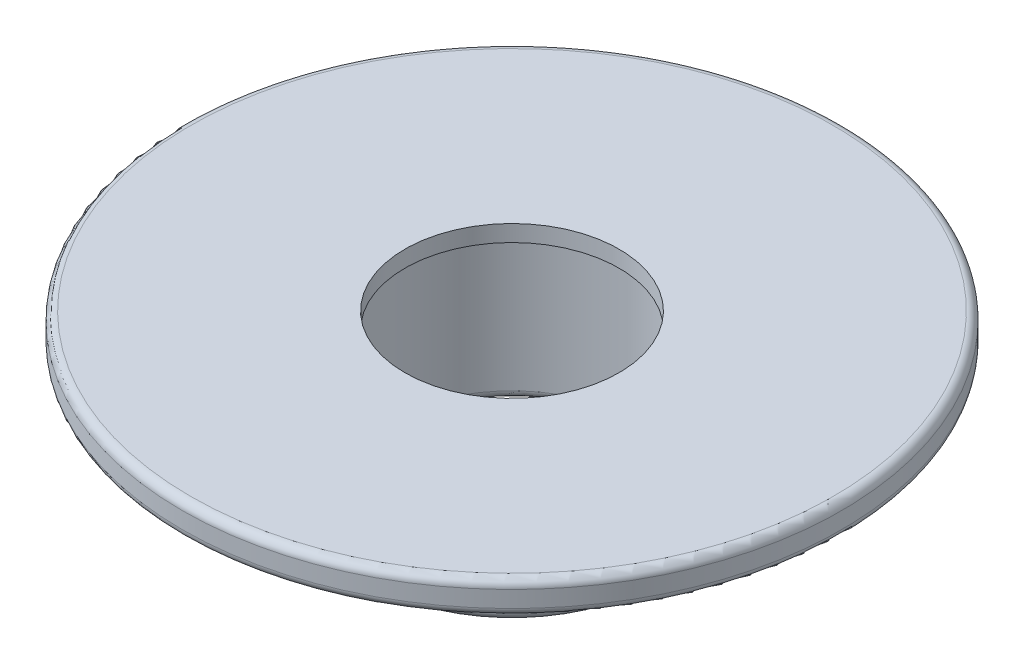
ISO-10303-21;
HEADER;
FILE_DESCRIPTION(('STEP AP214'),'2;1');
FILE_NAME('part.step','',(''),(''),'','','');
FILE_SCHEMA(('AUTOMOTIVE_DESIGN { 1 0 10303 214 1 1 1 1 }'));
ENDSEC;
DATA;
#1=APPLICATION_CONTEXT('core data for automotive mechanical design processes');
#2=APPLICATION_PROTOCOL_DEFINITION('international standard','automotive_design',2000,#1);
#3=PRODUCT_CONTEXT('',#1,'mechanical');
#4=PRODUCT('Part','Part','',(#3));
#5=PRODUCT_RELATED_PRODUCT_CATEGORY('part','',(#4));
#6=PRODUCT_DEFINITION_FORMATION('','',#4);
#7=PRODUCT_DEFINITION_CONTEXT('part definition',#1,'design');
#8=PRODUCT_DEFINITION('design','',#6,#7);
#9=PRODUCT_DEFINITION_SHAPE('','',#8);
#10=(LENGTH_UNIT() NAMED_UNIT(*) SI_UNIT(.MILLI.,.METRE.));
#11=(NAMED_UNIT(*) PLANE_ANGLE_UNIT() SI_UNIT($,.RADIAN.));
#12=(NAMED_UNIT(*) SI_UNIT($,.STERADIAN.) SOLID_ANGLE_UNIT());
#13=UNCERTAINTY_MEASURE_WITH_UNIT(LENGTH_MEASURE(1.E-05),#10,'distance_accuracy_value','');
#14=(GEOMETRIC_REPRESENTATION_CONTEXT(3) GLOBAL_UNCERTAINTY_ASSIGNED_CONTEXT((#13)) GLOBAL_UNIT_ASSIGNED_CONTEXT((#10,
#11,#12)) REPRESENTATION_CONTEXT('',''));
#15=CARTESIAN_POINT('',(0.,0.,0.));
#16=DIRECTION('',(0.,0.,1.));
#17=DIRECTION('',(1.,0.,0.));
#18=AXIS2_PLACEMENT_3D('',#15,#16,#17);
#19=CARTESIAN_POINT('',(0.,0.,0.));
#20=DIRECTION('',(0.,1.,0.));
#21=DIRECTION('',(0.,0.,1.));
#22=AXIS2_PLACEMENT_3D('',#19,#20,#21);
#23=PLANE('',#22);
#24=CARTESIAN_POINT('',(0.,0.,0.));
#25=DIRECTION('',(0.,1.,0.));
#26=DIRECTION('',(0.,0.,1.));
#27=AXIS2_PLACEMENT_3D('',#24,#25,#26);
#28=CIRCLE('',#27,8.);
#29=CARTESIAN_POINT('',(0.,0.,8.));
#30=VERTEX_POINT('',#29);
#31=EDGE_CURVE('E26',#30,#30,#28,.T.);
#32=ORIENTED_EDGE('',*,*,#31,.T.);
#33=EDGE_LOOP('',(#32));
#34=FACE_BOUND('',#33,.T.);
#35=CARTESIAN_POINT('',(0.,0.,0.));
#36=DIRECTION('',(0.,1.,0.));
#37=DIRECTION('',(0.,0.,1.));
#38=AXIS2_PLACEMENT_3D('',#35,#36,#37);
#39=CIRCLE('',#38,8.5);
#40=CARTESIAN_POINT('',(0.,0.,8.5));
#41=VERTEX_POINT('',#40);
#42=EDGE_CURVE('E30',#41,#41,#39,.F.);
#43=ORIENTED_EDGE('',*,*,#42,.T.);
#44=EDGE_LOOP('',(#43));
#45=FACE_BOUND('',#44,.T.);
#46=ADVANCED_FACE('F15',(#34,#45),#23,.F.);
#47=CARTESIAN_POINT('',(0.,10.,0.));
#48=DIRECTION('',(0.,1.,0.));
#49=DIRECTION('',(0.,0.,1.));
#50=AXIS2_PLACEMENT_3D('',#47,#48,#49);
#51=PLANE('',#50);
#52=CARTESIAN_POINT('',(0.,10.,0.));
#53=DIRECTION('',(0.,1.,0.));
#54=DIRECTION('',(0.,0.,1.));
#55=AXIS2_PLACEMENT_3D('',#52,#53,#54);
#56=CIRCLE('',#55,19.5);
#57=CARTESIAN_POINT('',(0.,10.,19.5));
#58=VERTEX_POINT('',#57);
#59=EDGE_CURVE('E44',#58,#58,#56,.T.);
#60=ORIENTED_EDGE('',*,*,#59,.T.);
#61=EDGE_LOOP('',(#60));
#62=FACE_BOUND('',#61,.T.);
#63=CARTESIAN_POINT('',(0.,10.,0.));
#64=DIRECTION('',(0.,1.,0.));
#65=DIRECTION('',(0.,0.,1.));
#66=AXIS2_PLACEMENT_3D('',#63,#64,#65);
#67=CIRCLE('',#66,6.5);
#68=CARTESIAN_POINT('',(0.,10.,6.5));
#69=VERTEX_POINT('',#68);
#70=EDGE_CURVE('E47',#69,#69,#67,.T.);
#71=ORIENTED_EDGE('',*,*,#70,.F.);
#72=EDGE_LOOP('',(#71));
#73=FACE_BOUND('',#72,.T.);
#74=ADVANCED_FACE('F79',(#62,#73),#51,.T.);
#75=CARTESIAN_POINT('',(0.,10.,0.));
#76=DIRECTION('',(0.,-1.,0.));
#77=DIRECTION('',(0.,0.,-1.));
#78=AXIS2_PLACEMENT_3D('',#75,#76,#77);
#79=CYLINDRICAL_SURFACE('',#78,20.);
#80=CARTESIAN_POINT('',(0.,9.5,0.));
#81=DIRECTION('',(0.,1.,0.));
#82=DIRECTION('',(0.,0.,1.));
#83=AXIS2_PLACEMENT_3D('',#80,#81,#82);
#84=CIRCLE('',#83,20.);
#85=CARTESIAN_POINT('',(0.,9.5,20.));
#86=VERTEX_POINT('',#85);
#87=EDGE_CURVE('E38',#86,#86,#84,.F.);
#88=ORIENTED_EDGE('',*,*,#87,.T.);
#89=EDGE_LOOP('',(#88));
#90=FACE_BOUND('',#89,.T.);
#91=CARTESIAN_POINT('',(0.,8.5,0.));
#92=DIRECTION('',(0.,1.,0.));
#93=DIRECTION('',(0.,0.,1.));
#94=AXIS2_PLACEMENT_3D('',#91,#92,#93);
#95=CIRCLE('',#94,20.);
#96=CARTESIAN_POINT('',(0.,8.5,20.));
#97=VERTEX_POINT('',#96);
#98=EDGE_CURVE('E41',#97,#97,#95,.T.);
#99=ORIENTED_EDGE('',*,*,#98,.T.);
#100=EDGE_LOOP('',(#99));
#101=FACE_BOUND('',#100,.T.);
#102=ADVANCED_FACE('F86',(#90,#101),#79,.T.);
#103=CARTESIAN_POINT('',(0.,10.,0.));
#104=DIRECTION('',(0.,-1.,0.));
#105=DIRECTION('',(0.,0.,-1.));
#106=AXIS2_PLACEMENT_3D('',#103,#104,#105);
#107=CYLINDRICAL_SURFACE('',#106,6.5);
#108=CARTESIAN_POINT('',(0.,9.,0.));
#109=DIRECTION('',(0.,1.,0.));
#110=DIRECTION('',(0.,0.,1.));
#111=AXIS2_PLACEMENT_3D('',#108,#109,#110);
#112=CIRCLE('',#111,6.5);
#113=CARTESIAN_POINT('',(0.,9.,6.5));
#114=VERTEX_POINT('',#113);
#115=EDGE_CURVE('E48',#114,#114,#112,.T.);
#116=ORIENTED_EDGE('',*,*,#115,.F.);
#117=EDGE_LOOP('',(#116));
#118=FACE_BOUND('',#117,.T.);
#119=ORIENTED_EDGE('',*,*,#70,.T.);
#120=EDGE_LOOP('',(#119));
#121=FACE_BOUND('',#120,.T.);
#122=ADVANCED_FACE('F93',(#118,#121),#107,.F.);
#123=CARTESIAN_POINT('',(0.,0.,0.));
#124=DIRECTION('',(0.,1.,0.));
#125=DIRECTION('',(0.,0.,1.));
#126=AXIS2_PLACEMENT_3D('',#123,#124,#125);
#127=CYLINDRICAL_SURFACE('',#126,7.5);
#128=CARTESIAN_POINT('',(0.,0.5,0.));
#129=DIRECTION('',(0.,1.,0.));
#130=DIRECTION('',(0.,0.,1.));
#131=AXIS2_PLACEMENT_3D('',#128,#129,#130);
#132=CIRCLE('',#131,7.5);
#133=CARTESIAN_POINT('',(0.,0.5,7.5));
#134=VERTEX_POINT('',#133);
#135=EDGE_CURVE('E22',#134,#134,#132,.F.);
#136=ORIENTED_EDGE('',*,*,#135,.T.);
#137=EDGE_LOOP('',(#136));
#138=FACE_BOUND('',#137,.T.);
#139=CARTESIAN_POINT('',(0.,9.,0.));
#140=DIRECTION('',(0.,1.,0.));
#141=DIRECTION('',(0.,0.,1.));
#142=AXIS2_PLACEMENT_3D('',#139,#140,#141);
#143=CIRCLE('',#142,7.5);
#144=CARTESIAN_POINT('',(0.,9.,7.5));
#145=VERTEX_POINT('',#144);
#146=EDGE_CURVE('E51',#145,#145,#143,.T.);
#147=ORIENTED_EDGE('',*,*,#146,.T.);
#148=EDGE_LOOP('',(#147));
#149=FACE_BOUND('',#148,.T.);
#150=ADVANCED_FACE('F153',(#138,#149),#127,.F.);
#151=CARTESIAN_POINT('',(0.,9.,0.));
#152=DIRECTION('',(0.,1.,0.));
#153=DIRECTION('',(0.,0.,1.));
#154=AXIS2_PLACEMENT_3D('',#151,#152,#153);
#155=PLANE('',#154);
#156=ORIENTED_EDGE('',*,*,#115,.T.);
#157=EDGE_LOOP('',(#156));
#158=FACE_BOUND('',#157,.T.);
#159=ORIENTED_EDGE('',*,*,#146,.F.);
#160=EDGE_LOOP('',(#159));
#161=FACE_BOUND('',#160,.T.);
#162=ADVANCED_FACE('F75',(#158,#161),#155,.F.);
#163=CARTESIAN_POINT('',(0.,8.,0.));
#164=DIRECTION('',(0.,1.,0.));
#165=DIRECTION('',(0.,0.,1.));
#166=AXIS2_PLACEMENT_3D('',#163,#164,#165);
#167=PLANE('',#166);
#168=CARTESIAN_POINT('',(0.,8.,0.));
#169=DIRECTION('',(0.,1.,0.));
#170=DIRECTION('',(0.,0.,1.));
#171=AXIS2_PLACEMENT_3D('',#168,#169,#170);
#172=CIRCLE('',#171,19.5);
#173=CARTESIAN_POINT('',(0.,8.,19.5));
#174=VERTEX_POINT('',#173);
#175=EDGE_CURVE('E35',#174,#174,#172,.F.);
#176=ORIENTED_EDGE('',*,*,#175,.T.);
#177=EDGE_LOOP('',(#176));
#178=FACE_BOUND('',#177,.T.);
#179=CARTESIAN_POINT('',(0.,8.,0.));
#180=DIRECTION('',(0.,1.,0.));
#181=DIRECTION('',(0.,0.,1.));
#182=AXIS2_PLACEMENT_3D('',#179,#180,#181);
#183=CIRCLE('',#182,9.);
#184=CARTESIAN_POINT('',(0.,8.,9.));
#185=VERTEX_POINT('',#184);
#186=EDGE_CURVE('E56',#185,#185,#183,.T.);
#187=ORIENTED_EDGE('',*,*,#186,.T.);
#188=EDGE_LOOP('',(#187));
#189=FACE_BOUND('',#188,.T.);
#190=ADVANCED_FACE('F60',(#178,#189),#167,.F.);
#191=CARTESIAN_POINT('',(0.,0.,0.));
#192=DIRECTION('',(0.,1.,0.));
#193=DIRECTION('',(0.,0.,1.));
#194=AXIS2_PLACEMENT_3D('',#191,#192,#193);
#195=CYLINDRICAL_SURFACE('',#194,9.);
#196=CARTESIAN_POINT('',(0.,0.5,0.));
#197=DIRECTION('',(0.,1.,0.));
#198=DIRECTION('',(0.,0.,1.));
#199=AXIS2_PLACEMENT_3D('',#196,#197,#198);
#200=CIRCLE('',#199,9.);
#201=CARTESIAN_POINT('',(0.,0.5,9.));
#202=VERTEX_POINT('',#201);
#203=EDGE_CURVE('E10',#202,#202,#200,.T.);
#204=ORIENTED_EDGE('',*,*,#203,.T.);
#205=EDGE_LOOP('',(#204));
#206=FACE_BOUND('',#205,.T.);
#207=ORIENTED_EDGE('',*,*,#186,.F.);
#208=EDGE_LOOP('',(#207));
#209=FACE_BOUND('',#208,.T.);
#210=ADVANCED_FACE('F62',(#206,#209),#195,.T.);
#211=CARTESIAN_POINT('',(0.,9.5,0.));
#212=DIRECTION('',(0.,1.,0.));
#213=DIRECTION('',(0.,0.,1.));
#214=AXIS2_PLACEMENT_3D('',#211,#212,#213);
#215=TOROIDAL_SURFACE('',#214,19.5,0.5);
#216=ORIENTED_EDGE('',*,*,#87,.F.);
#217=EDGE_LOOP('',(#216));
#218=FACE_BOUND('',#217,.T.);
#219=ORIENTED_EDGE('',*,*,#59,.F.);
#220=EDGE_LOOP('',(#219));
#221=FACE_BOUND('',#220,.T.);
#222=ADVANCED_FACE('F64',(#218,#221),#215,.T.);
#223=CARTESIAN_POINT('',(0.,8.5,0.));
#224=DIRECTION('',(0.,1.,0.));
#225=DIRECTION('',(0.,0.,1.));
#226=AXIS2_PLACEMENT_3D('',#223,#224,#225);
#227=TOROIDAL_SURFACE('',#226,19.5,0.5);
#228=ORIENTED_EDGE('',*,*,#175,.F.);
#229=EDGE_LOOP('',(#228));
#230=FACE_BOUND('',#229,.T.);
#231=ORIENTED_EDGE('',*,*,#98,.F.);
#232=EDGE_LOOP('',(#231));
#233=FACE_BOUND('',#232,.T.);
#234=ADVANCED_FACE('F72',(#230,#233),#227,.T.);
#235=CARTESIAN_POINT('',(0.,0.5,0.));
#236=DIRECTION('',(0.,1.,0.));
#237=DIRECTION('',(0.,0.,1.));
#238=AXIS2_PLACEMENT_3D('',#235,#236,#237);
#239=TOROIDAL_SURFACE('',#238,8.,0.5);
#240=ORIENTED_EDGE('',*,*,#135,.F.);
#241=EDGE_LOOP('',(#240));
#242=FACE_BOUND('',#241,.T.);
#243=ORIENTED_EDGE('',*,*,#31,.F.);
#244=EDGE_LOOP('',(#243));
#245=FACE_BOUND('',#244,.T.);
#246=ADVANCED_FACE('F97',(#242,#245),#239,.T.);
#247=CARTESIAN_POINT('',(0.,0.5,0.));
#248=DIRECTION('',(0.,1.,0.));
#249=DIRECTION('',(0.,0.,1.));
#250=AXIS2_PLACEMENT_3D('',#247,#248,#249);
#251=TOROIDAL_SURFACE('',#250,8.5,0.5);
#252=ORIENTED_EDGE('',*,*,#42,.F.);
#253=EDGE_LOOP('',(#252));
#254=FACE_BOUND('',#253,.T.);
#255=ORIENTED_EDGE('',*,*,#203,.F.);
#256=EDGE_LOOP('',(#255));
#257=FACE_BOUND('',#256,.T.);
#258=ADVANCED_FACE('F17',(#254,#257),#251,.T.);
#259=CLOSED_SHELL('',(#46,#74,#102,#122,#150,#162,#190,#210,#222,#234,#246,#258));
#260=MANIFOLD_SOLID_BREP('B1',#259);
#261=ADVANCED_BREP_SHAPE_REPRESENTATION('',(#18,#260),#14);
#262=SHAPE_DEFINITION_REPRESENTATION(#9,#261);
ENDSEC;
END-ISO-10303-21;
